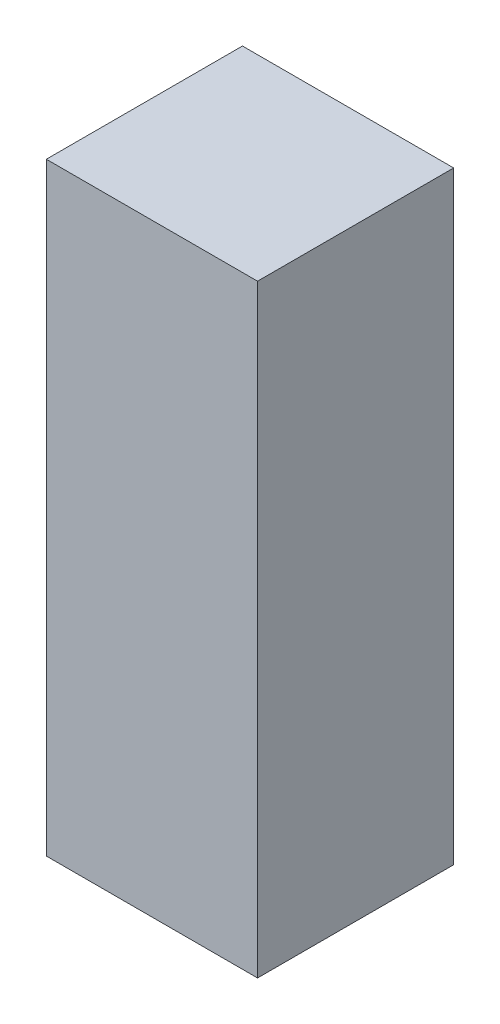
ISO-10303-21;
HEADER;
FILE_DESCRIPTION(('STEP AP214'),'2;1');
FILE_NAME('part.step','',(''),(''),'','','');
FILE_SCHEMA(('AUTOMOTIVE_DESIGN { 1 0 10303 214 1 1 1 1 }'));
ENDSEC;
DATA;
#1=APPLICATION_CONTEXT('core data for automotive mechanical design processes');
#2=APPLICATION_PROTOCOL_DEFINITION('international standard','automotive_design',2000,#1);
#3=PRODUCT_CONTEXT('',#1,'mechanical');
#4=PRODUCT('Part','Part','',(#3));
#5=PRODUCT_RELATED_PRODUCT_CATEGORY('part','',(#4));
#6=PRODUCT_DEFINITION_FORMATION('','',#4);
#7=PRODUCT_DEFINITION_CONTEXT('part definition',#1,'design');
#8=PRODUCT_DEFINITION('design','',#6,#7);
#9=PRODUCT_DEFINITION_SHAPE('','',#8);
#10=(LENGTH_UNIT() NAMED_UNIT(*) SI_UNIT(.MILLI.,.METRE.));
#11=(NAMED_UNIT(*) PLANE_ANGLE_UNIT() SI_UNIT($,.RADIAN.));
#12=(NAMED_UNIT(*) SI_UNIT($,.STERADIAN.) SOLID_ANGLE_UNIT());
#13=UNCERTAINTY_MEASURE_WITH_UNIT(LENGTH_MEASURE(1.E-05),#10,'distance_accuracy_value','');
#14=(GEOMETRIC_REPRESENTATION_CONTEXT(3) GLOBAL_UNCERTAINTY_ASSIGNED_CONTEXT((#13)) GLOBAL_UNIT_ASSIGNED_CONTEXT((#10,
#11,#12)) REPRESENTATION_CONTEXT('',''));
#15=CARTESIAN_POINT('',(0.,0.,0.));
#16=DIRECTION('',(0.,0.,1.));
#17=DIRECTION('',(1.,0.,0.));
#18=AXIS2_PLACEMENT_3D('',#15,#16,#17);
#19=CARTESIAN_POINT('',(24.,1720.,33.));
#20=DIRECTION('',(1.,0.,0.));
#21=DIRECTION('',(0.,0.,-1.));
#22=AXIS2_PLACEMENT_3D('',#19,#20,#21);
#23=PLANE('',#22);
#24=DIRECTION('',(0.,-1.,0.));
#25=VECTOR('',#24,1.);
#26=CARTESIAN_POINT('',(24.,1720.,20.));
#27=LINE('',#26,#25);
#28=CARTESIAN_POINT('',(24.,1760.,20.));
#29=VERTEX_POINT('',#28);
#30=CARTESIAN_POINT('',(24.,1720.,20.));
#31=VERTEX_POINT('',#30);
#32=EDGE_CURVE('E102',#29,#31,#27,.T.);
#33=ORIENTED_EDGE('',*,*,#32,.T.);
#34=DIRECTION('',(0.,0.,-1.));
#35=VECTOR('',#34,1.);
#36=CARTESIAN_POINT('',(24.,1720.,33.));
#37=LINE('',#36,#35);
#38=CARTESIAN_POINT('',(24.,1720.,33.));
#39=VERTEX_POINT('',#38);
#40=EDGE_CURVE('E11',#39,#31,#37,.T.);
#41=ORIENTED_EDGE('',*,*,#40,.F.);
#42=DIRECTION('',(0.,-1.,0.));
#43=VECTOR('',#42,1.);
#44=CARTESIAN_POINT('',(24.,1720.,33.));
#45=LINE('',#44,#43);
#46=CARTESIAN_POINT('',(24.,1760.,33.));
#47=VERTEX_POINT('',#46);
#48=EDGE_CURVE('E90',#47,#39,#45,.T.);
#49=ORIENTED_EDGE('',*,*,#48,.F.);
#50=DIRECTION('',(0.,0.,-1.));
#51=VECTOR('',#50,1.);
#52=CARTESIAN_POINT('',(24.,1760.,33.));
#53=LINE('',#52,#51);
#54=EDGE_CURVE('E98',#47,#29,#53,.T.);
#55=ORIENTED_EDGE('',*,*,#54,.T.);
#56=EDGE_LOOP('',(#33,#41,#49,#55));
#57=FACE_BOUND('',#56,.T.);
#58=ADVANCED_FACE('F39',(#57),#23,.F.);
#59=CARTESIAN_POINT('',(24.,1720.,33.));
#60=DIRECTION('',(0.,1.,0.));
#61=DIRECTION('',(0.,0.,1.));
#62=AXIS2_PLACEMENT_3D('',#59,#60,#61);
#63=PLANE('',#62);
#64=DIRECTION('',(1.,0.,0.));
#65=VECTOR('',#64,1.);
#66=CARTESIAN_POINT('',(24.,1720.,20.));
#67=LINE('',#66,#65);
#68=CARTESIAN_POINT('',(38.,1720.,20.));
#69=VERTEX_POINT('',#68);
#70=EDGE_CURVE('E94',#31,#69,#67,.T.);
#71=ORIENTED_EDGE('',*,*,#70,.T.);
#72=DIRECTION('',(0.,0.,-1.));
#73=VECTOR('',#72,1.);
#74=CARTESIAN_POINT('',(38.,1720.,33.));
#75=LINE('',#74,#73);
#76=CARTESIAN_POINT('',(38.,1720.,33.));
#77=VERTEX_POINT('',#76);
#78=EDGE_CURVE('E47',#77,#69,#75,.T.);
#79=ORIENTED_EDGE('',*,*,#78,.F.);
#80=DIRECTION('',(1.,0.,0.));
#81=VECTOR('',#80,1.);
#82=CARTESIAN_POINT('',(24.,1720.,33.));
#83=LINE('',#82,#81);
#84=EDGE_CURVE('E85',#39,#77,#83,.T.);
#85=ORIENTED_EDGE('',*,*,#84,.F.);
#86=ORIENTED_EDGE('',*,*,#40,.T.);
#87=EDGE_LOOP('',(#71,#79,#85,#86));
#88=FACE_BOUND('',#87,.T.);
#89=ADVANCED_FACE('F93',(#88),#63,.F.);
#90=CARTESIAN_POINT('',(38.,1720.,33.));
#91=DIRECTION('',(-1.,0.,0.));
#92=DIRECTION('',(0.,0.,1.));
#93=AXIS2_PLACEMENT_3D('',#90,#91,#92);
#94=PLANE('',#93);
#95=DIRECTION('',(0.,1.,0.));
#96=VECTOR('',#95,1.);
#97=CARTESIAN_POINT('',(38.,1720.,20.));
#98=LINE('',#97,#96);
#99=CARTESIAN_POINT('',(38.,1760.,20.));
#100=VERTEX_POINT('',#99);
#101=EDGE_CURVE('E72',#69,#100,#98,.T.);
#102=ORIENTED_EDGE('',*,*,#101,.T.);
#103=DIRECTION('',(0.,0.,-1.));
#104=VECTOR('',#103,1.);
#105=CARTESIAN_POINT('',(38.,1760.,33.));
#106=LINE('',#105,#104);
#107=CARTESIAN_POINT('',(38.,1760.,33.));
#108=VERTEX_POINT('',#107);
#109=EDGE_CURVE('E95',#108,#100,#106,.T.);
#110=ORIENTED_EDGE('',*,*,#109,.F.);
#111=DIRECTION('',(0.,1.,0.));
#112=VECTOR('',#111,1.);
#113=CARTESIAN_POINT('',(38.,1720.,33.));
#114=LINE('',#113,#112);
#115=EDGE_CURVE('E88',#77,#108,#114,.T.);
#116=ORIENTED_EDGE('',*,*,#115,.F.);
#117=ORIENTED_EDGE('',*,*,#78,.T.);
#118=EDGE_LOOP('',(#102,#110,#116,#117));
#119=FACE_BOUND('',#118,.T.);
#120=ADVANCED_FACE('F96',(#119),#94,.F.);
#121=CARTESIAN_POINT('',(24.,1760.,33.));
#122=DIRECTION('',(0.,-1.,0.));
#123=DIRECTION('',(0.,0.,-1.));
#124=AXIS2_PLACEMENT_3D('',#121,#122,#123);
#125=PLANE('',#124);
#126=DIRECTION('',(-1.,0.,0.));
#127=VECTOR('',#126,1.);
#128=CARTESIAN_POINT('',(24.,1760.,20.));
#129=LINE('',#128,#127);
#130=EDGE_CURVE('E78',#100,#29,#129,.T.);
#131=ORIENTED_EDGE('',*,*,#130,.T.);
#132=ORIENTED_EDGE('',*,*,#54,.F.);
#133=DIRECTION('',(-1.,0.,0.));
#134=VECTOR('',#133,1.);
#135=CARTESIAN_POINT('',(24.,1760.,33.));
#136=LINE('',#135,#134);
#137=EDGE_CURVE('E55',#108,#47,#136,.T.);
#138=ORIENTED_EDGE('',*,*,#137,.F.);
#139=ORIENTED_EDGE('',*,*,#109,.T.);
#140=EDGE_LOOP('',(#131,#132,#138,#139));
#141=FACE_BOUND('',#140,.T.);
#142=ADVANCED_FACE('F109',(#141),#125,.F.);
#143=CARTESIAN_POINT('',(0.,0.,33.));
#144=DIRECTION('',(0.,0.,-1.));
#145=DIRECTION('',(-1.,0.,0.));
#146=AXIS2_PLACEMENT_3D('',#143,#144,#145);
#147=PLANE('',#146);
#148=ORIENTED_EDGE('',*,*,#48,.T.);
#149=ORIENTED_EDGE('',*,*,#84,.T.);
#150=ORIENTED_EDGE('',*,*,#115,.T.);
#151=ORIENTED_EDGE('',*,*,#137,.T.);
#152=EDGE_LOOP('',(#148,#149,#150,#151));
#153=FACE_BOUND('',#152,.T.);
#154=ADVANCED_FACE('F86',(#153),#147,.F.);
#155=CARTESIAN_POINT('',(0.,0.,20.));
#156=DIRECTION('',(0.,0.,-1.));
#157=DIRECTION('',(-1.,0.,0.));
#158=AXIS2_PLACEMENT_3D('',#155,#156,#157);
#159=PLANE('',#158);
#160=ORIENTED_EDGE('',*,*,#32,.F.);
#161=ORIENTED_EDGE('',*,*,#130,.F.);
#162=ORIENTED_EDGE('',*,*,#101,.F.);
#163=ORIENTED_EDGE('',*,*,#70,.F.);
#164=EDGE_LOOP('',(#160,#161,#162,#163));
#165=FACE_BOUND('',#164,.T.);
#166=ADVANCED_FACE('F112',(#165),#159,.T.);
#167=CLOSED_SHELL('',(#58,#89,#120,#142,#154,#166));
#168=MANIFOLD_SOLID_BREP('B2',#167);
#169=ADVANCED_BREP_SHAPE_REPRESENTATION('',(#18,#168),#14);
#170=SHAPE_DEFINITION_REPRESENTATION(#9,#169);
ENDSEC;
END-ISO-10303-21;
